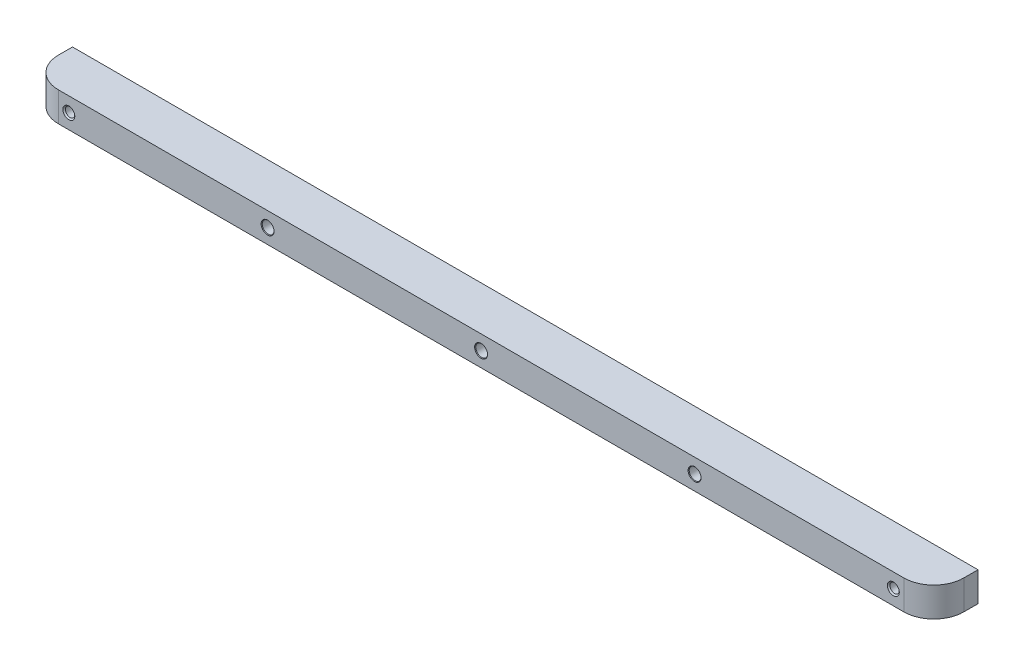
ISO-10303-21;
HEADER;
FILE_DESCRIPTION(('STEP AP214'),'2;1');
FILE_NAME('part.step','',(''),(''),'','','');
FILE_SCHEMA(('AUTOMOTIVE_DESIGN { 1 0 10303 214 1 1 1 1 }'));
ENDSEC;
DATA;
#1=APPLICATION_CONTEXT('core data for automotive mechanical design processes');
#2=APPLICATION_PROTOCOL_DEFINITION('international standard','automotive_design',2000,#1);
#3=PRODUCT_CONTEXT('',#1,'mechanical');
#4=PRODUCT('Part','Part','',(#3));
#5=PRODUCT_RELATED_PRODUCT_CATEGORY('part','',(#4));
#6=PRODUCT_DEFINITION_FORMATION('','',#4);
#7=PRODUCT_DEFINITION_CONTEXT('part definition',#1,'design');
#8=PRODUCT_DEFINITION('design','',#6,#7);
#9=PRODUCT_DEFINITION_SHAPE('','',#8);
#10=(LENGTH_UNIT() NAMED_UNIT(*) SI_UNIT(.MILLI.,.METRE.));
#11=(NAMED_UNIT(*) PLANE_ANGLE_UNIT() SI_UNIT($,.RADIAN.));
#12=(NAMED_UNIT(*) SI_UNIT($,.STERADIAN.) SOLID_ANGLE_UNIT());
#13=UNCERTAINTY_MEASURE_WITH_UNIT(LENGTH_MEASURE(1.E-05),#10,'distance_accuracy_value','');
#14=(GEOMETRIC_REPRESENTATION_CONTEXT(3) GLOBAL_UNCERTAINTY_ASSIGNED_CONTEXT((#13)) GLOBAL_UNIT_ASSIGNED_CONTEXT((#10,
#11,#12)) REPRESENTATION_CONTEXT('',''));
#15=CARTESIAN_POINT('',(0.,0.,0.));
#16=DIRECTION('',(0.,0.,1.));
#17=DIRECTION('',(1.,0.,0.));
#18=AXIS2_PLACEMENT_3D('',#15,#16,#17);
#19=CARTESIAN_POINT('',(-195.2625,6.35,-19.05));
#20=DIRECTION('',(1.,0.,0.));
#21=DIRECTION('',(0.,0.,-1.));
#22=AXIS2_PLACEMENT_3D('',#19,#20,#21);
#23=PLANE('',#22);
#24=DIRECTION('',(0.,0.,1.));
#25=VECTOR('',#24,1.);
#26=CARTESIAN_POINT('',(-195.2625,-6.35,-19.05));
#27=LINE('',#26,#25);
#28=CARTESIAN_POINT('',(-195.2625,-6.35,-19.05));
#29=VERTEX_POINT('',#28);
#30=CARTESIAN_POINT('',(-195.2625,-6.35,-12.954));
#31=VERTEX_POINT('',#30);
#32=EDGE_CURVE('E135',#29,#31,#27,.T.);
#33=ORIENTED_EDGE('',*,*,#32,.T.);
#34=DIRECTION('',(0.,-1.,0.));
#35=VECTOR('',#34,1.);
#36=CARTESIAN_POINT('',(-195.2625,6.35,-12.954));
#37=LINE('',#36,#35);
#38=CARTESIAN_POINT('',(-195.2625,6.35,-12.954));
#39=VERTEX_POINT('',#38);
#40=EDGE_CURVE('E62',#31,#39,#37,.F.);
#41=ORIENTED_EDGE('',*,*,#40,.T.);
#42=DIRECTION('',(0.,0.,1.));
#43=VECTOR('',#42,1.);
#44=CARTESIAN_POINT('',(-195.2625,6.35,-19.05));
#45=LINE('',#44,#43);
#46=CARTESIAN_POINT('',(-195.2625,6.35,-19.05));
#47=VERTEX_POINT('',#46);
#48=EDGE_CURVE('E174',#47,#39,#45,.T.);
#49=ORIENTED_EDGE('',*,*,#48,.F.);
#50=DIRECTION('',(0.,-1.,0.));
#51=VECTOR('',#50,1.);
#52=CARTESIAN_POINT('',(-195.2625,6.35,-19.05));
#53=LINE('',#52,#51);
#54=EDGE_CURVE('E127',#47,#29,#53,.T.);
#55=ORIENTED_EDGE('',*,*,#54,.T.);
#56=EDGE_LOOP('',(#33,#41,#49,#55));
#57=FACE_BOUND('',#56,.T.);
#58=ADVANCED_FACE('F47',(#57),#23,.F.);
#59=CARTESIAN_POINT('',(-195.2625,6.35,0.));
#60=DIRECTION('',(0.,0.,-1.));
#61=DIRECTION('',(-1.,0.,0.));
#62=AXIS2_PLACEMENT_3D('',#59,#60,#61);
#63=PLANE('',#62);
#64=CARTESIAN_POINT('',(177.8,0.,0.));
#65=DIRECTION('',(0.,0.,-1.));
#66=DIRECTION('',(-1.,0.,0.));
#67=AXIS2_PLACEMENT_3D('',#64,#65,#66);
#68=CIRCLE('',#67,2.57810000000003);
#69=CARTESIAN_POINT('',(175.2219,0.,0.));
#70=VERTEX_POINT('',#69);
#71=EDGE_CURVE('E203',#70,#70,#68,.T.);
#72=ORIENTED_EDGE('',*,*,#71,.T.);
#73=EDGE_LOOP('',(#72));
#74=FACE_BOUND('',#73,.T.);
#75=CARTESIAN_POINT('',(-177.8,0.,0.));
#76=DIRECTION('',(0.,0.,-1.));
#77=DIRECTION('',(-1.,0.,0.));
#78=AXIS2_PLACEMENT_3D('',#75,#76,#77);
#79=CIRCLE('',#78,2.57810000000003);
#80=CARTESIAN_POINT('',(-180.3781,0.,0.));
#81=VERTEX_POINT('',#80);
#82=EDGE_CURVE('E199',#81,#81,#79,.T.);
#83=ORIENTED_EDGE('',*,*,#82,.T.);
#84=EDGE_LOOP('',(#83));
#85=FACE_BOUND('',#84,.T.);
#86=CARTESIAN_POINT('',(92.075,0.,0.));
#87=DIRECTION('',(0.,0.,-1.));
#88=DIRECTION('',(-1.,0.,0.));
#89=AXIS2_PLACEMENT_3D('',#86,#87,#88);
#90=CIRCLE('',#89,2.79399999999999);
#91=CARTESIAN_POINT('',(89.281,0.,0.));
#92=VERTEX_POINT('',#91);
#93=EDGE_CURVE('E612',#92,#92,#90,.T.);
#94=ORIENTED_EDGE('',*,*,#93,.T.);
#95=EDGE_LOOP('',(#94));
#96=FACE_BOUND('',#95,.T.);
#97=CARTESIAN_POINT('',(0.,0.,0.));
#98=DIRECTION('',(0.,0.,-1.));
#99=DIRECTION('',(-1.,0.,0.));
#100=AXIS2_PLACEMENT_3D('',#97,#98,#99);
#101=CIRCLE('',#100,2.794);
#102=CARTESIAN_POINT('',(-2.794,0.,0.));
#103=VERTEX_POINT('',#102);
#104=EDGE_CURVE('E597',#103,#103,#101,.T.);
#105=ORIENTED_EDGE('',*,*,#104,.T.);
#106=EDGE_LOOP('',(#105));
#107=FACE_BOUND('',#106,.T.);
#108=CARTESIAN_POINT('',(-92.075,0.,0.));
#109=DIRECTION('',(0.,0.,-1.));
#110=DIRECTION('',(-1.,0.,0.));
#111=AXIS2_PLACEMENT_3D('',#108,#109,#110);
#112=CIRCLE('',#111,2.79399999999999);
#113=CARTESIAN_POINT('',(-94.869,0.,0.));
#114=VERTEX_POINT('',#113);
#115=EDGE_CURVE('E211',#114,#114,#112,.T.);
#116=ORIENTED_EDGE('',*,*,#115,.T.);
#117=EDGE_LOOP('',(#116));
#118=FACE_BOUND('',#117,.T.);
#119=DIRECTION('',(1.,0.,0.));
#120=VECTOR('',#119,1.);
#121=CARTESIAN_POINT('',(-195.2625,-6.35,0.));
#122=LINE('',#121,#120);
#123=CARTESIAN_POINT('',(-182.3085,-6.35,0.));
#124=VERTEX_POINT('',#123);
#125=CARTESIAN_POINT('',(182.3085,-6.35,0.));
#126=VERTEX_POINT('',#125);
#127=EDGE_CURVE('E139',#124,#126,#122,.T.);
#128=ORIENTED_EDGE('',*,*,#127,.T.);
#129=DIRECTION('',(0.,-1.,0.));
#130=VECTOR('',#129,1.);
#131=CARTESIAN_POINT('',(182.3085,6.35,0.));
#132=LINE('',#131,#130);
#133=CARTESIAN_POINT('',(182.3085,6.35,0.));
#134=VERTEX_POINT('',#133);
#135=EDGE_CURVE('E70',#126,#134,#132,.F.);
#136=ORIENTED_EDGE('',*,*,#135,.T.);
#137=DIRECTION('',(1.,0.,0.));
#138=VECTOR('',#137,1.);
#139=CARTESIAN_POINT('',(-195.2625,6.35,0.));
#140=LINE('',#139,#138);
#141=CARTESIAN_POINT('',(-182.3085,6.35,0.));
#142=VERTEX_POINT('',#141);
#143=EDGE_CURVE('E117',#142,#134,#140,.T.);
#144=ORIENTED_EDGE('',*,*,#143,.F.);
#145=DIRECTION('',(0.,-1.,0.));
#146=VECTOR('',#145,1.);
#147=CARTESIAN_POINT('',(-182.3085,6.35,0.));
#148=LINE('',#147,#146);
#149=EDGE_CURVE('E346',#142,#124,#148,.T.);
#150=ORIENTED_EDGE('',*,*,#149,.T.);
#151=EDGE_LOOP('',(#128,#136,#144,#150));
#152=FACE_BOUND('',#151,.T.);
#153=ADVANCED_FACE('F255',(#74,#85,#96,#107,#118,#152),#63,.F.);
#154=CARTESIAN_POINT('',(195.2625,6.35,-19.05));
#155=DIRECTION('',(-1.,0.,0.));
#156=DIRECTION('',(0.,0.,1.));
#157=AXIS2_PLACEMENT_3D('',#154,#155,#156);
#158=PLANE('',#157);
#159=DIRECTION('',(0.,0.,-1.));
#160=VECTOR('',#159,1.);
#161=CARTESIAN_POINT('',(195.2625,6.35,-19.05));
#162=LINE('',#161,#160);
#163=CARTESIAN_POINT('',(195.2625,6.35,-12.954));
#164=VERTEX_POINT('',#163);
#165=CARTESIAN_POINT('',(195.2625,6.35,-19.05));
#166=VERTEX_POINT('',#165);
#167=EDGE_CURVE('E106',#164,#166,#162,.T.);
#168=ORIENTED_EDGE('',*,*,#167,.F.);
#169=DIRECTION('',(0.,-1.,0.));
#170=VECTOR('',#169,1.);
#171=CARTESIAN_POINT('',(195.2625,6.35,-12.954));
#172=LINE('',#171,#170);
#173=CARTESIAN_POINT('',(195.2625,-6.35,-12.954));
#174=VERTEX_POINT('',#173);
#175=EDGE_CURVE('E126',#164,#174,#172,.T.);
#176=ORIENTED_EDGE('',*,*,#175,.T.);
#177=DIRECTION('',(0.,0.,-1.));
#178=VECTOR('',#177,1.);
#179=CARTESIAN_POINT('',(195.2625,-6.35,-19.05));
#180=LINE('',#179,#178);
#181=CARTESIAN_POINT('',(195.2625,-6.35,-19.05));
#182=VERTEX_POINT('',#181);
#183=EDGE_CURVE('E123',#174,#182,#180,.T.);
#184=ORIENTED_EDGE('',*,*,#183,.T.);
#185=DIRECTION('',(0.,-1.,0.));
#186=VECTOR('',#185,1.);
#187=CARTESIAN_POINT('',(195.2625,6.35,-19.05));
#188=LINE('',#187,#186);
#189=EDGE_CURVE('E120',#166,#182,#188,.T.);
#190=ORIENTED_EDGE('',*,*,#189,.F.);
#191=EDGE_LOOP('',(#168,#176,#184,#190));
#192=FACE_BOUND('',#191,.T.);
#193=ADVANCED_FACE('F121',(#192),#158,.F.);
#194=CARTESIAN_POINT('',(-195.2625,6.35,-19.05));
#195=DIRECTION('',(0.,0.,1.));
#196=DIRECTION('',(1.,0.,0.));
#197=AXIS2_PLACEMENT_3D('',#194,#195,#196);
#198=PLANE('',#197);
#199=CARTESIAN_POINT('',(-177.8,0.,-19.05));
#200=DIRECTION('',(0.,0.,1.));
#201=DIRECTION('',(1.,0.,0.));
#202=AXIS2_PLACEMENT_3D('',#199,#200,#201);
#203=CIRCLE('',#202,2.80670000000005);
#204=CARTESIAN_POINT('',(-174.9933,0.,-19.05));
#205=VERTEX_POINT('',#204);
#206=EDGE_CURVE('E193',#205,#205,#203,.T.);
#207=ORIENTED_EDGE('',*,*,#206,.T.);
#208=EDGE_LOOP('',(#207));
#209=FACE_BOUND('',#208,.T.);
#210=CARTESIAN_POINT('',(177.8,0.,-19.05));
#211=DIRECTION('',(0.,0.,1.));
#212=DIRECTION('',(1.,0.,0.));
#213=AXIS2_PLACEMENT_3D('',#210,#211,#212);
#214=CIRCLE('',#213,2.80670000000005);
#215=CARTESIAN_POINT('',(180.6067,0.,-19.05));
#216=VERTEX_POINT('',#215);
#217=EDGE_CURVE('E190',#216,#216,#214,.T.);
#218=ORIENTED_EDGE('',*,*,#217,.T.);
#219=EDGE_LOOP('',(#218));
#220=FACE_BOUND('',#219,.T.);
#221=CARTESIAN_POINT('',(92.075,0.,-19.05));
#222=DIRECTION('',(0.,0.,-1.));
#223=DIRECTION('',(-1.,0.,0.));
#224=AXIS2_PLACEMENT_3D('',#221,#222,#223);
#225=CIRCLE('',#224,4.6228);
#226=CARTESIAN_POINT('',(87.4522,0.,-19.05));
#227=VERTEX_POINT('',#226);
#228=EDGE_CURVE('E602',#227,#227,#225,.T.);
#229=ORIENTED_EDGE('',*,*,#228,.F.);
#230=EDGE_LOOP('',(#229));
#231=FACE_BOUND('',#230,.T.);
#232=CARTESIAN_POINT('',(0.,0.,-19.05));
#233=DIRECTION('',(0.,0.,-1.));
#234=DIRECTION('',(-1.,0.,0.));
#235=AXIS2_PLACEMENT_3D('',#232,#233,#234);
#236=CIRCLE('',#235,4.6228);
#237=CARTESIAN_POINT('',(-4.6228,0.,-19.05));
#238=VERTEX_POINT('',#237);
#239=EDGE_CURVE('E217',#238,#238,#236,.T.);
#240=ORIENTED_EDGE('',*,*,#239,.F.);
#241=EDGE_LOOP('',(#240));
#242=FACE_BOUND('',#241,.T.);
#243=CARTESIAN_POINT('',(-92.075,0.,-19.05));
#244=DIRECTION('',(0.,0.,-1.));
#245=DIRECTION('',(-1.,0.,0.));
#246=AXIS2_PLACEMENT_3D('',#243,#244,#245);
#247=CIRCLE('',#246,4.6228);
#248=CARTESIAN_POINT('',(-96.6978,0.,-19.05));
#249=VERTEX_POINT('',#248);
#250=EDGE_CURVE('E160',#249,#249,#247,.T.);
#251=ORIENTED_EDGE('',*,*,#250,.F.);
#252=EDGE_LOOP('',(#251));
#253=FACE_BOUND('',#252,.T.);
#254=DIRECTION('',(-1.,0.,0.));
#255=VECTOR('',#254,1.);
#256=CARTESIAN_POINT('',(-195.2625,-6.35,-19.05));
#257=LINE('',#256,#255);
#258=EDGE_CURVE('E175',#182,#29,#257,.T.);
#259=ORIENTED_EDGE('',*,*,#258,.T.);
#260=ORIENTED_EDGE('',*,*,#54,.F.);
#261=DIRECTION('',(-1.,0.,0.));
#262=VECTOR('',#261,1.);
#263=CARTESIAN_POINT('',(-195.2625,6.35,-19.05));
#264=LINE('',#263,#262);
#265=EDGE_CURVE('E110',#166,#47,#264,.T.);
#266=ORIENTED_EDGE('',*,*,#265,.F.);
#267=ORIENTED_EDGE('',*,*,#189,.T.);
#268=EDGE_LOOP('',(#259,#260,#266,#267));
#269=FACE_BOUND('',#268,.T.);
#270=ADVANCED_FACE('F129',(#209,#220,#231,#242,#253,#269),#198,.F.);
#271=CARTESIAN_POINT('',(-195.2625,6.35,0.));
#272=DIRECTION('',(0.,1.,0.));
#273=DIRECTION('',(0.,0.,1.));
#274=AXIS2_PLACEMENT_3D('',#271,#272,#273);
#275=PLANE('',#274);
#276=ORIENTED_EDGE('',*,*,#143,.T.);
#277=CARTESIAN_POINT('',(182.3085,6.35,-12.954));
#278=DIRECTION('',(0.,1.,0.));
#279=DIRECTION('',(0.,0.,1.));
#280=AXIS2_PLACEMENT_3D('',#277,#278,#279);
#281=CIRCLE('',#280,12.954);
#282=EDGE_CURVE('E113',#134,#164,#281,.T.);
#283=ORIENTED_EDGE('',*,*,#282,.T.);
#284=ORIENTED_EDGE('',*,*,#167,.T.);
#285=ORIENTED_EDGE('',*,*,#265,.T.);
#286=ORIENTED_EDGE('',*,*,#48,.T.);
#287=CARTESIAN_POINT('',(-182.3085,6.35,-12.954));
#288=DIRECTION('',(0.,1.,0.));
#289=DIRECTION('',(0.,0.,1.));
#290=AXIS2_PLACEMENT_3D('',#287,#288,#289);
#291=CIRCLE('',#290,12.954);
#292=EDGE_CURVE('E177',#39,#142,#291,.T.);
#293=ORIENTED_EDGE('',*,*,#292,.T.);
#294=EDGE_LOOP('',(#276,#283,#284,#285,#286,#293));
#295=FACE_BOUND('',#294,.T.);
#296=ADVANCED_FACE('F108',(#295),#275,.T.);
#297=CARTESIAN_POINT('',(-195.2625,-6.35,0.));
#298=DIRECTION('',(0.,1.,0.));
#299=DIRECTION('',(0.,0.,1.));
#300=AXIS2_PLACEMENT_3D('',#297,#298,#299);
#301=PLANE('',#300);
#302=ORIENTED_EDGE('',*,*,#183,.F.);
#303=CARTESIAN_POINT('',(182.3085,-6.35,-12.954));
#304=DIRECTION('',(0.,1.,0.));
#305=DIRECTION('',(0.,0.,1.));
#306=AXIS2_PLACEMENT_3D('',#303,#304,#305);
#307=CIRCLE('',#306,12.954);
#308=EDGE_CURVE('E331',#174,#126,#307,.F.);
#309=ORIENTED_EDGE('',*,*,#308,.T.);
#310=ORIENTED_EDGE('',*,*,#127,.F.);
#311=CARTESIAN_POINT('',(-182.3085,-6.35,-12.954));
#312=DIRECTION('',(0.,1.,0.));
#313=DIRECTION('',(0.,0.,1.));
#314=AXIS2_PLACEMENT_3D('',#311,#312,#313);
#315=CIRCLE('',#314,12.954);
#316=EDGE_CURVE('E342',#124,#31,#315,.F.);
#317=ORIENTED_EDGE('',*,*,#316,.T.);
#318=ORIENTED_EDGE('',*,*,#32,.F.);
#319=ORIENTED_EDGE('',*,*,#258,.F.);
#320=EDGE_LOOP('',(#302,#309,#310,#317,#318,#319));
#321=FACE_BOUND('',#320,.T.);
#322=ADVANCED_FACE('F253',(#321),#301,.F.);
#323=CARTESIAN_POINT('',(182.3085,6.35,-12.954));
#324=DIRECTION('',(0.,-1.,0.));
#325=DIRECTION('',(0.,0.,-1.));
#326=AXIS2_PLACEMENT_3D('',#323,#324,#325);
#327=CYLINDRICAL_SURFACE('',#326,12.954);
#328=ORIENTED_EDGE('',*,*,#282,.F.);
#329=ORIENTED_EDGE('',*,*,#135,.F.);
#330=ORIENTED_EDGE('',*,*,#308,.F.);
#331=ORIENTED_EDGE('',*,*,#175,.F.);
#332=EDGE_LOOP('',(#328,#329,#330,#331));
#333=FACE_BOUND('',#332,.T.);
#334=ADVANCED_FACE('F181',(#333),#327,.T.);
#335=CARTESIAN_POINT('',(-182.3085,6.35,-12.954));
#336=DIRECTION('',(0.,-1.,0.));
#337=DIRECTION('',(0.,0.,-1.));
#338=AXIS2_PLACEMENT_3D('',#335,#336,#337);
#339=CYLINDRICAL_SURFACE('',#338,12.954);
#340=ORIENTED_EDGE('',*,*,#292,.F.);
#341=ORIENTED_EDGE('',*,*,#40,.F.);
#342=ORIENTED_EDGE('',*,*,#316,.F.);
#343=ORIENTED_EDGE('',*,*,#149,.F.);
#344=EDGE_LOOP('',(#340,#341,#342,#343));
#345=FACE_BOUND('',#344,.T.);
#346=ADVANCED_FACE('F269',(#345),#339,.T.);
#347=CARTESIAN_POINT('',(-177.8,0.,-19.05));
#348=DIRECTION('',(0.,0.,-1.));
#349=DIRECTION('',(-1.,0.,0.));
#350=AXIS2_PLACEMENT_3D('',#347,#348,#349);
#351=CYLINDRICAL_SURFACE('',#350,2.0193);
#352=CARTESIAN_POINT('',(-177.8,0.,-0.558800000000033));
#353=DIRECTION('',(0.,0.,-1.));
#354=DIRECTION('',(-1.,0.,0.));
#355=AXIS2_PLACEMENT_3D('',#352,#353,#354);
#356=CIRCLE('',#355,2.0193);
#357=CARTESIAN_POINT('',(-179.8193,0.,-0.558800000000033));
#358=VERTEX_POINT('',#357);
#359=EDGE_CURVE('E12',#358,#358,#356,.F.);
#360=ORIENTED_EDGE('',*,*,#359,.T.);
#361=EDGE_LOOP('',(#360));
#362=FACE_BOUND('',#361,.T.);
#363=CARTESIAN_POINT('',(-177.8,0.,-9.2045009458107));
#364=DIRECTION('',(0.,0.,-1.));
#365=DIRECTION('',(-1.,0.,0.));
#366=AXIS2_PLACEMENT_3D('',#363,#364,#365);
#367=CIRCLE('',#366,2.0193);
#368=CARTESIAN_POINT('',(-179.8193,0.,-9.2045009458107));
#369=VERTEX_POINT('',#368);
#370=EDGE_CURVE('E140',#369,#369,#367,.T.);
#371=ORIENTED_EDGE('',*,*,#370,.T.);
#372=EDGE_LOOP('',(#371));
#373=FACE_BOUND('',#372,.T.);
#374=ADVANCED_FACE('F272',(#362,#373),#351,.F.);
#375=CARTESIAN_POINT('',(-177.8,0.,-9.525));
#376=DIRECTION('',(0.,0.,-1.));
#377=DIRECTION('',(-1.,0.,0.));
#378=AXIS2_PLACEMENT_3D('',#375,#376,#377);
#379=CONICAL_SURFACE('',#378,2.55269999999999,1.02974425867665);
#380=ORIENTED_EDGE('',*,*,#370,.F.);
#381=EDGE_LOOP('',(#380));
#382=FACE_BOUND('',#381,.T.);
#383=CARTESIAN_POINT('',(-177.8,0.,-9.525));
#384=DIRECTION('',(0.,0.,-1.));
#385=DIRECTION('',(-1.,0.,0.));
#386=AXIS2_PLACEMENT_3D('',#383,#384,#385);
#387=CIRCLE('',#386,2.55269999999999);
#388=CARTESIAN_POINT('',(-180.3527,0.,-9.525));
#389=VERTEX_POINT('',#388);
#390=EDGE_CURVE('E169',#389,#389,#387,.T.);
#391=ORIENTED_EDGE('',*,*,#390,.T.);
#392=EDGE_LOOP('',(#391));
#393=FACE_BOUND('',#392,.T.);
#394=ADVANCED_FACE('F319',(#382,#393),#379,.F.);
#395=CARTESIAN_POINT('',(-177.8,0.,-19.05));
#396=DIRECTION('',(0.,0.,-1.));
#397=DIRECTION('',(-1.,0.,0.));
#398=AXIS2_PLACEMENT_3D('',#395,#396,#397);
#399=CYLINDRICAL_SURFACE('',#398,2.55269999999999);
#400=CARTESIAN_POINT('',(-177.8,0.,-18.796));
#401=DIRECTION('',(0.,0.,1.));
#402=DIRECTION('',(1.,0.,0.));
#403=AXIS2_PLACEMENT_3D('',#400,#401,#402);
#404=CIRCLE('',#403,2.55269999999999);
#405=CARTESIAN_POINT('',(-175.2473,0.,-18.796));
#406=VERTEX_POINT('',#405);
#407=EDGE_CURVE('E183',#406,#406,#404,.F.);
#408=ORIENTED_EDGE('',*,*,#407,.T.);
#409=EDGE_LOOP('',(#408));
#410=FACE_BOUND('',#409,.T.);
#411=ORIENTED_EDGE('',*,*,#390,.F.);
#412=EDGE_LOOP('',(#411));
#413=FACE_BOUND('',#412,.T.);
#414=ADVANCED_FACE('F302',(#410,#413),#399,.F.);
#415=CARTESIAN_POINT('',(177.8,0.,-19.05));
#416=DIRECTION('',(0.,0.,-1.));
#417=DIRECTION('',(-1.,0.,0.));
#418=AXIS2_PLACEMENT_3D('',#415,#416,#417);
#419=CYLINDRICAL_SURFACE('',#418,2.0193);
#420=CARTESIAN_POINT('',(177.8,0.,-0.558800000000033));
#421=DIRECTION('',(0.,0.,-1.));
#422=DIRECTION('',(-1.,0.,0.));
#423=AXIS2_PLACEMENT_3D('',#420,#421,#422);
#424=CIRCLE('',#423,2.0193);
#425=CARTESIAN_POINT('',(175.7807,0.,-0.558800000000033));
#426=VERTEX_POINT('',#425);
#427=EDGE_CURVE('E55',#426,#426,#424,.F.);
#428=ORIENTED_EDGE('',*,*,#427,.T.);
#429=EDGE_LOOP('',(#428));
#430=FACE_BOUND('',#429,.T.);
#431=CARTESIAN_POINT('',(177.8,0.,-9.2045009458107));
#432=DIRECTION('',(0.,0.,-1.));
#433=DIRECTION('',(-1.,0.,0.));
#434=AXIS2_PLACEMENT_3D('',#431,#432,#433);
#435=CIRCLE('',#434,2.0193);
#436=CARTESIAN_POINT('',(175.7807,0.,-9.2045009458107));
#437=VERTEX_POINT('',#436);
#438=EDGE_CURVE('E166',#437,#437,#435,.T.);
#439=ORIENTED_EDGE('',*,*,#438,.T.);
#440=EDGE_LOOP('',(#439));
#441=FACE_BOUND('',#440,.T.);
#442=ADVANCED_FACE('F298',(#430,#441),#419,.F.);
#443=CARTESIAN_POINT('',(177.8,0.,-9.525));
#444=DIRECTION('',(0.,0.,-1.));
#445=DIRECTION('',(-1.,0.,0.));
#446=AXIS2_PLACEMENT_3D('',#443,#444,#445);
#447=CONICAL_SURFACE('',#446,2.55269999999999,1.02974425867665);
#448=ORIENTED_EDGE('',*,*,#438,.F.);
#449=EDGE_LOOP('',(#448));
#450=FACE_BOUND('',#449,.T.);
#451=CARTESIAN_POINT('',(177.8,0.,-9.525));
#452=DIRECTION('',(0.,0.,-1.));
#453=DIRECTION('',(-1.,0.,0.));
#454=AXIS2_PLACEMENT_3D('',#451,#452,#453);
#455=CIRCLE('',#454,2.55269999999999);
#456=CARTESIAN_POINT('',(175.2473,0.,-9.525));
#457=VERTEX_POINT('',#456);
#458=EDGE_CURVE('E163',#457,#457,#455,.T.);
#459=ORIENTED_EDGE('',*,*,#458,.T.);
#460=EDGE_LOOP('',(#459));
#461=FACE_BOUND('',#460,.T.);
#462=ADVANCED_FACE('F301',(#450,#461),#447,.F.);
#463=CARTESIAN_POINT('',(177.8,0.,-19.05));
#464=DIRECTION('',(0.,0.,-1.));
#465=DIRECTION('',(-1.,0.,0.));
#466=AXIS2_PLACEMENT_3D('',#463,#464,#465);
#467=CYLINDRICAL_SURFACE('',#466,2.55269999999999);
#468=CARTESIAN_POINT('',(177.8,0.,-18.796));
#469=DIRECTION('',(0.,0.,1.));
#470=DIRECTION('',(1.,0.,0.));
#471=AXIS2_PLACEMENT_3D('',#468,#469,#470);
#472=CIRCLE('',#471,2.55269999999999);
#473=CARTESIAN_POINT('',(180.3527,0.,-18.796));
#474=VERTEX_POINT('',#473);
#475=EDGE_CURVE('E196',#474,#474,#472,.F.);
#476=ORIENTED_EDGE('',*,*,#475,.T.);
#477=EDGE_LOOP('',(#476));
#478=FACE_BOUND('',#477,.T.);
#479=ORIENTED_EDGE('',*,*,#458,.F.);
#480=EDGE_LOOP('',(#479));
#481=FACE_BOUND('',#480,.T.);
#482=ADVANCED_FACE('F242',(#478,#481),#467,.F.);
#483=CARTESIAN_POINT('',(-92.075,0.,-19.05));
#484=DIRECTION('',(0.,0.,-1.));
#485=DIRECTION('',(-1.,0.,0.));
#486=AXIS2_PLACEMENT_3D('',#483,#484,#485);
#487=CONICAL_SURFACE('',#486,4.6228,0.785398163397455);
#488=CARTESIAN_POINT('',(-92.075,0.,-18.796));
#489=DIRECTION('',(0.,0.,-1.));
#490=DIRECTION('',(-1.,0.,0.));
#491=AXIS2_PLACEMENT_3D('',#488,#489,#490);
#492=CIRCLE('',#491,4.36879999999999);
#493=CARTESIAN_POINT('',(-96.4438,0.,-18.796));
#494=VERTEX_POINT('',#493);
#495=EDGE_CURVE('E155',#494,#494,#492,.T.);
#496=ORIENTED_EDGE('',*,*,#495,.F.);
#497=EDGE_LOOP('',(#496));
#498=FACE_BOUND('',#497,.T.);
#499=ORIENTED_EDGE('',*,*,#250,.T.);
#500=EDGE_LOOP('',(#499));
#501=FACE_BOUND('',#500,.T.);
#502=ADVANCED_FACE('F236',(#498,#501),#487,.F.);
#503=CARTESIAN_POINT('',(-92.075,0.,-19.05));
#504=DIRECTION('',(0.,0.,-1.));
#505=DIRECTION('',(-1.,0.,0.));
#506=AXIS2_PLACEMENT_3D('',#503,#504,#505);
#507=CYLINDRICAL_SURFACE('',#506,4.36879999999999);
#508=CARTESIAN_POINT('',(-92.075,0.,-13.716));
#509=DIRECTION('',(0.,0.,-1.));
#510=DIRECTION('',(-1.,0.,0.));
#511=AXIS2_PLACEMENT_3D('',#508,#509,#510);
#512=CIRCLE('',#511,4.36879999999999);
#513=CARTESIAN_POINT('',(-96.4438,0.,-13.716));
#514=VERTEX_POINT('',#513);
#515=EDGE_CURVE('E149',#514,#514,#512,.T.);
#516=ORIENTED_EDGE('',*,*,#515,.F.);
#517=EDGE_LOOP('',(#516));
#518=FACE_BOUND('',#517,.T.);
#519=ORIENTED_EDGE('',*,*,#495,.T.);
#520=EDGE_LOOP('',(#519));
#521=FACE_BOUND('',#520,.T.);
#522=ADVANCED_FACE('F230',(#518,#521),#507,.F.);
#523=CARTESIAN_POINT('',(-87.7062,0.,-13.716));
#524=DIRECTION('',(0.,0.,1.));
#525=DIRECTION('',(1.,0.,0.));
#526=AXIS2_PLACEMENT_3D('',#523,#524,#525);
#527=PLANE('',#526);
#528=CARTESIAN_POINT('',(-92.075,0.,-13.716));
#529=DIRECTION('',(0.,0.,-1.));
#530=DIRECTION('',(-1.,0.,0.));
#531=AXIS2_PLACEMENT_3D('',#528,#529,#530);
#532=CIRCLE('',#531,2.55270000000001);
#533=CARTESIAN_POINT('',(-94.6277,0.,-13.716));
#534=VERTEX_POINT('',#533);
#535=EDGE_CURVE('E156',#534,#534,#532,.T.);
#536=ORIENTED_EDGE('',*,*,#535,.F.);
#537=EDGE_LOOP('',(#536));
#538=FACE_BOUND('',#537,.T.);
#539=ORIENTED_EDGE('',*,*,#515,.T.);
#540=EDGE_LOOP('',(#539));
#541=FACE_BOUND('',#540,.T.);
#542=ADVANCED_FACE('F227',(#538,#541),#527,.F.);
#543=CARTESIAN_POINT('',(-92.075,0.,-19.05));
#544=DIRECTION('',(0.,0.,-1.));
#545=DIRECTION('',(-1.,0.,0.));
#546=AXIS2_PLACEMENT_3D('',#543,#544,#545);
#547=CYLINDRICAL_SURFACE('',#546,2.5527);
#548=CARTESIAN_POINT('',(-92.075,0.,-0.2413));
#549=DIRECTION('',(0.,0.,-1.));
#550=DIRECTION('',(-1.,0.,0.));
#551=AXIS2_PLACEMENT_3D('',#548,#549,#550);
#552=CIRCLE('',#551,2.55269999999999);
#553=CARTESIAN_POINT('',(-94.6277,0.,-0.2413));
#554=VERTEX_POINT('',#553);
#555=EDGE_CURVE('E216',#554,#554,#552,.T.);
#556=ORIENTED_EDGE('',*,*,#555,.F.);
#557=EDGE_LOOP('',(#556));
#558=FACE_BOUND('',#557,.T.);
#559=ORIENTED_EDGE('',*,*,#535,.T.);
#560=EDGE_LOOP('',(#559));
#561=FACE_BOUND('',#560,.T.);
#562=ADVANCED_FACE('F225',(#558,#561),#547,.F.);
#563=CARTESIAN_POINT('',(-92.075,0.,-0.2413));
#564=DIRECTION('',(0.,0.,1.));
#565=DIRECTION('',(1.,0.,0.));
#566=AXIS2_PLACEMENT_3D('',#563,#564,#565);
#567=CONICAL_SURFACE('',#566,2.55269999999999,0.785398163397448);
#568=ORIENTED_EDGE('',*,*,#115,.F.);
#569=EDGE_LOOP('',(#568));
#570=FACE_BOUND('',#569,.T.);
#571=ORIENTED_EDGE('',*,*,#555,.T.);
#572=EDGE_LOOP('',(#571));
#573=FACE_BOUND('',#572,.T.);
#574=ADVANCED_FACE('F444',(#570,#573),#567,.F.);
#575=CARTESIAN_POINT('',(0.,0.,-19.05));
#576=DIRECTION('',(0.,0.,-1.));
#577=DIRECTION('',(-1.,0.,0.));
#578=AXIS2_PLACEMENT_3D('',#575,#576,#577);
#579=CONICAL_SURFACE('',#578,4.6228,0.78539816339745);
#580=CARTESIAN_POINT('',(0.,0.,-18.796));
#581=DIRECTION('',(0.,0.,-1.));
#582=DIRECTION('',(-1.,0.,0.));
#583=AXIS2_PLACEMENT_3D('',#580,#581,#582);
#584=CIRCLE('',#583,4.3688);
#585=CARTESIAN_POINT('',(-4.3688,0.,-18.796));
#586=VERTEX_POINT('',#585);
#587=EDGE_CURVE('E585',#586,#586,#584,.T.);
#588=ORIENTED_EDGE('',*,*,#587,.F.);
#589=EDGE_LOOP('',(#588));
#590=FACE_BOUND('',#589,.T.);
#591=ORIENTED_EDGE('',*,*,#239,.T.);
#592=EDGE_LOOP('',(#591));
#593=FACE_BOUND('',#592,.T.);
#594=ADVANCED_FACE('F454',(#590,#593),#579,.F.);
#595=CARTESIAN_POINT('',(0.,0.,-19.05));
#596=DIRECTION('',(0.,0.,-1.));
#597=DIRECTION('',(-1.,0.,0.));
#598=AXIS2_PLACEMENT_3D('',#595,#596,#597);
#599=CYLINDRICAL_SURFACE('',#598,4.3688);
#600=CARTESIAN_POINT('',(0.,0.,-13.716));
#601=DIRECTION('',(0.,0.,-1.));
#602=DIRECTION('',(-1.,0.,0.));
#603=AXIS2_PLACEMENT_3D('',#600,#601,#602);
#604=CIRCLE('',#603,4.3688);
#605=CARTESIAN_POINT('',(-4.3688,0.,-13.716));
#606=VERTEX_POINT('',#605);
#607=EDGE_CURVE('E582',#606,#606,#604,.T.);
#608=ORIENTED_EDGE('',*,*,#607,.F.);
#609=EDGE_LOOP('',(#608));
#610=FACE_BOUND('',#609,.T.);
#611=ORIENTED_EDGE('',*,*,#587,.T.);
#612=EDGE_LOOP('',(#611));
#613=FACE_BOUND('',#612,.T.);
#614=ADVANCED_FACE('F464',(#610,#613),#599,.F.);
#615=CARTESIAN_POINT('',(4.3688,0.,-13.716));
#616=DIRECTION('',(0.,0.,1.));
#617=DIRECTION('',(1.,0.,0.));
#618=AXIS2_PLACEMENT_3D('',#615,#616,#617);
#619=PLANE('',#618);
#620=CARTESIAN_POINT('',(0.,0.,-13.716));
#621=DIRECTION('',(0.,0.,-1.));
#622=DIRECTION('',(-1.,0.,0.));
#623=AXIS2_PLACEMENT_3D('',#620,#621,#622);
#624=CIRCLE('',#623,2.5527);
#625=CARTESIAN_POINT('',(-2.5527,0.,-13.716));
#626=VERTEX_POINT('',#625);
#627=EDGE_CURVE('E586',#626,#626,#624,.T.);
#628=ORIENTED_EDGE('',*,*,#627,.F.);
#629=EDGE_LOOP('',(#628));
#630=FACE_BOUND('',#629,.T.);
#631=ORIENTED_EDGE('',*,*,#607,.T.);
#632=EDGE_LOOP('',(#631));
#633=FACE_BOUND('',#632,.T.);
#634=ADVANCED_FACE('F474',(#630,#633),#619,.F.);
#635=CARTESIAN_POINT('',(0.,0.,-19.05));
#636=DIRECTION('',(0.,0.,-1.));
#637=DIRECTION('',(-1.,0.,0.));
#638=AXIS2_PLACEMENT_3D('',#635,#636,#637);
#639=CYLINDRICAL_SURFACE('',#638,2.5527);
#640=CARTESIAN_POINT('',(0.,0.,-0.2413));
#641=DIRECTION('',(0.,0.,-1.));
#642=DIRECTION('',(-1.,0.,0.));
#643=AXIS2_PLACEMENT_3D('',#640,#641,#642);
#644=CIRCLE('',#643,2.5527);
#645=CARTESIAN_POINT('',(-2.5527,0.,-0.2413));
#646=VERTEX_POINT('',#645);
#647=EDGE_CURVE('E592',#646,#646,#644,.T.);
#648=ORIENTED_EDGE('',*,*,#647,.F.);
#649=EDGE_LOOP('',(#648));
#650=FACE_BOUND('',#649,.T.);
#651=ORIENTED_EDGE('',*,*,#627,.T.);
#652=EDGE_LOOP('',(#651));
#653=FACE_BOUND('',#652,.T.);
#654=ADVANCED_FACE('F484',(#650,#653),#639,.F.);
#655=CARTESIAN_POINT('',(0.,0.,-0.2413));
#656=DIRECTION('',(0.,0.,1.));
#657=DIRECTION('',(1.,0.,0.));
#658=AXIS2_PLACEMENT_3D('',#655,#656,#657);
#659=CONICAL_SURFACE('',#658,2.5527,0.785398163397448);
#660=ORIENTED_EDGE('',*,*,#104,.F.);
#661=EDGE_LOOP('',(#660));
#662=FACE_BOUND('',#661,.T.);
#663=ORIENTED_EDGE('',*,*,#647,.T.);
#664=EDGE_LOOP('',(#663));
#665=FACE_BOUND('',#664,.T.);
#666=ADVANCED_FACE('F494',(#662,#665),#659,.F.);
#667=CARTESIAN_POINT('',(92.075,0.,-19.05));
#668=DIRECTION('',(0.,0.,-1.));
#669=DIRECTION('',(-1.,0.,0.));
#670=AXIS2_PLACEMENT_3D('',#667,#668,#669);
#671=CONICAL_SURFACE('',#670,4.6228,0.785398163397455);
#672=CARTESIAN_POINT('',(92.075,0.,-18.796));
#673=DIRECTION('',(0.,0.,-1.));
#674=DIRECTION('',(-1.,0.,0.));
#675=AXIS2_PLACEMENT_3D('',#672,#673,#674);
#676=CIRCLE('',#675,4.36879999999999);
#677=CARTESIAN_POINT('',(87.7062,0.,-18.796));
#678=VERTEX_POINT('',#677);
#679=EDGE_CURVE('E580',#678,#678,#676,.T.);
#680=ORIENTED_EDGE('',*,*,#679,.F.);
#681=EDGE_LOOP('',(#680));
#682=FACE_BOUND('',#681,.T.);
#683=ORIENTED_EDGE('',*,*,#228,.T.);
#684=EDGE_LOOP('',(#683));
#685=FACE_BOUND('',#684,.T.);
#686=ADVANCED_FACE('F504',(#682,#685),#671,.F.);
#687=CARTESIAN_POINT('',(92.075,0.,-19.05));
#688=DIRECTION('',(0.,0.,-1.));
#689=DIRECTION('',(-1.,0.,0.));
#690=AXIS2_PLACEMENT_3D('',#687,#688,#689);
#691=CYLINDRICAL_SURFACE('',#690,4.36879999999999);
#692=CARTESIAN_POINT('',(92.075,0.,-13.716));
#693=DIRECTION('',(0.,0.,-1.));
#694=DIRECTION('',(-1.,0.,0.));
#695=AXIS2_PLACEMENT_3D('',#692,#693,#694);
#696=CIRCLE('',#695,4.36879999999999);
#697=CARTESIAN_POINT('',(87.7062,0.,-13.716));
#698=VERTEX_POINT('',#697);
#699=EDGE_CURVE('E576',#698,#698,#696,.T.);
#700=ORIENTED_EDGE('',*,*,#699,.F.);
#701=EDGE_LOOP('',(#700));
#702=FACE_BOUND('',#701,.T.);
#703=ORIENTED_EDGE('',*,*,#679,.T.);
#704=EDGE_LOOP('',(#703));
#705=FACE_BOUND('',#704,.T.);
#706=ADVANCED_FACE('F514',(#702,#705),#691,.F.);
#707=CARTESIAN_POINT('',(96.4438,0.,-13.716));
#708=DIRECTION('',(0.,0.,1.));
#709=DIRECTION('',(1.,0.,0.));
#710=AXIS2_PLACEMENT_3D('',#707,#708,#709);
#711=PLANE('',#710);
#712=CARTESIAN_POINT('',(92.075,0.,-13.716));
#713=DIRECTION('',(0.,0.,-1.));
#714=DIRECTION('',(-1.,0.,0.));
#715=AXIS2_PLACEMENT_3D('',#712,#713,#714);
#716=CIRCLE('',#715,2.55270000000001);
#717=CARTESIAN_POINT('',(89.5223,0.,-13.716));
#718=VERTEX_POINT('',#717);
#719=EDGE_CURVE('E581',#718,#718,#716,.T.);
#720=ORIENTED_EDGE('',*,*,#719,.F.);
#721=EDGE_LOOP('',(#720));
#722=FACE_BOUND('',#721,.T.);
#723=ORIENTED_EDGE('',*,*,#699,.T.);
#724=EDGE_LOOP('',(#723));
#725=FACE_BOUND('',#724,.T.);
#726=ADVANCED_FACE('F524',(#722,#725),#711,.F.);
#727=CARTESIAN_POINT('',(92.075,0.,-19.05));
#728=DIRECTION('',(0.,0.,-1.));
#729=DIRECTION('',(-1.,0.,0.));
#730=AXIS2_PLACEMENT_3D('',#727,#728,#729);
#731=CYLINDRICAL_SURFACE('',#730,2.5527);
#732=CARTESIAN_POINT('',(92.075,0.,-0.2413));
#733=DIRECTION('',(0.,0.,-1.));
#734=DIRECTION('',(-1.,0.,0.));
#735=AXIS2_PLACEMENT_3D('',#732,#733,#734);
#736=CIRCLE('',#735,2.55269999999999);
#737=CARTESIAN_POINT('',(89.5223,0.,-0.2413));
#738=VERTEX_POINT('',#737);
#739=EDGE_CURVE('E610',#738,#738,#736,.T.);
#740=ORIENTED_EDGE('',*,*,#739,.F.);
#741=EDGE_LOOP('',(#740));
#742=FACE_BOUND('',#741,.T.);
#743=ORIENTED_EDGE('',*,*,#719,.T.);
#744=EDGE_LOOP('',(#743));
#745=FACE_BOUND('',#744,.T.);
#746=ADVANCED_FACE('F534',(#742,#745),#731,.F.);
#747=CARTESIAN_POINT('',(92.075,0.,-0.2413));
#748=DIRECTION('',(0.,0.,1.));
#749=DIRECTION('',(1.,0.,0.));
#750=AXIS2_PLACEMENT_3D('',#747,#748,#749);
#751=CONICAL_SURFACE('',#750,2.55269999999999,0.785398163397448);
#752=ORIENTED_EDGE('',*,*,#93,.F.);
#753=EDGE_LOOP('',(#752));
#754=FACE_BOUND('',#753,.T.);
#755=ORIENTED_EDGE('',*,*,#739,.T.);
#756=EDGE_LOOP('',(#755));
#757=FACE_BOUND('',#756,.T.);
#758=ADVANCED_FACE('F278',(#754,#757),#751,.F.);
#759=CARTESIAN_POINT('',(-177.8,0.,-18.796));
#760=DIRECTION('',(0.,0.,-1.));
#761=DIRECTION('',(-1.,0.,0.));
#762=AXIS2_PLACEMENT_3D('',#759,#760,#761);
#763=CONICAL_SURFACE('',#762,2.55269999999999,0.785398163397469);
#764=ORIENTED_EDGE('',*,*,#206,.F.);
#765=EDGE_LOOP('',(#764));
#766=FACE_BOUND('',#765,.T.);
#767=ORIENTED_EDGE('',*,*,#407,.F.);
#768=EDGE_LOOP('',(#767));
#769=FACE_BOUND('',#768,.T.);
#770=ADVANCED_FACE('F274',(#766,#769),#763,.F.);
#771=CARTESIAN_POINT('',(177.8,0.,-18.796));
#772=DIRECTION('',(0.,0.,-1.));
#773=DIRECTION('',(-1.,0.,0.));
#774=AXIS2_PLACEMENT_3D('',#771,#772,#773);
#775=CONICAL_SURFACE('',#774,2.55269999999999,0.785398163397469);
#776=ORIENTED_EDGE('',*,*,#217,.F.);
#777=EDGE_LOOP('',(#776));
#778=FACE_BOUND('',#777,.T.);
#779=ORIENTED_EDGE('',*,*,#475,.F.);
#780=EDGE_LOOP('',(#779));
#781=FACE_BOUND('',#780,.T.);
#782=ADVANCED_FACE('F277',(#778,#781),#775,.F.);
#783=CARTESIAN_POINT('',(177.8,0.,0.));
#784=DIRECTION('',(0.,0.,1.));
#785=DIRECTION('',(1.,0.,0.));
#786=AXIS2_PLACEMENT_3D('',#783,#784,#785);
#787=CONICAL_SURFACE('',#786,2.57810000000003,0.785398163397442);
#788=ORIENTED_EDGE('',*,*,#427,.F.);
#789=EDGE_LOOP('',(#788));
#790=FACE_BOUND('',#789,.T.);
#791=ORIENTED_EDGE('',*,*,#71,.F.);
#792=EDGE_LOOP('',(#791));
#793=FACE_BOUND('',#792,.T.);
#794=ADVANCED_FACE('F281',(#790,#793),#787,.F.);
#795=CARTESIAN_POINT('',(-177.8,0.,0.));
#796=DIRECTION('',(0.,0.,1.));
#797=DIRECTION('',(1.,0.,0.));
#798=AXIS2_PLACEMENT_3D('',#795,#796,#797);
#799=CONICAL_SURFACE('',#798,2.57810000000003,0.785398163397442);
#800=ORIENTED_EDGE('',*,*,#359,.F.);
#801=EDGE_LOOP('',(#800));
#802=FACE_BOUND('',#801,.T.);
#803=ORIENTED_EDGE('',*,*,#82,.F.);
#804=EDGE_LOOP('',(#803));
#805=FACE_BOUND('',#804,.T.);
#806=ADVANCED_FACE('F49',(#802,#805),#799,.F.);
#807=CLOSED_SHELL('',(#58,#153,#193,#270,#296,#322,#334,#346,#374,#394,#414,#442,#462,#482,#502,
#522,#542,#562,#574,#594,#614,#634,#654,#666,#686,#706,#726,#746,#758,#770,#782,#794,#806));
#808=MANIFOLD_SOLID_BREP('B2',#807);
#809=ADVANCED_BREP_SHAPE_REPRESENTATION('',(#18,#808),#14);
#810=SHAPE_DEFINITION_REPRESENTATION(#9,#809);
ENDSEC;
END-ISO-10303-21;
